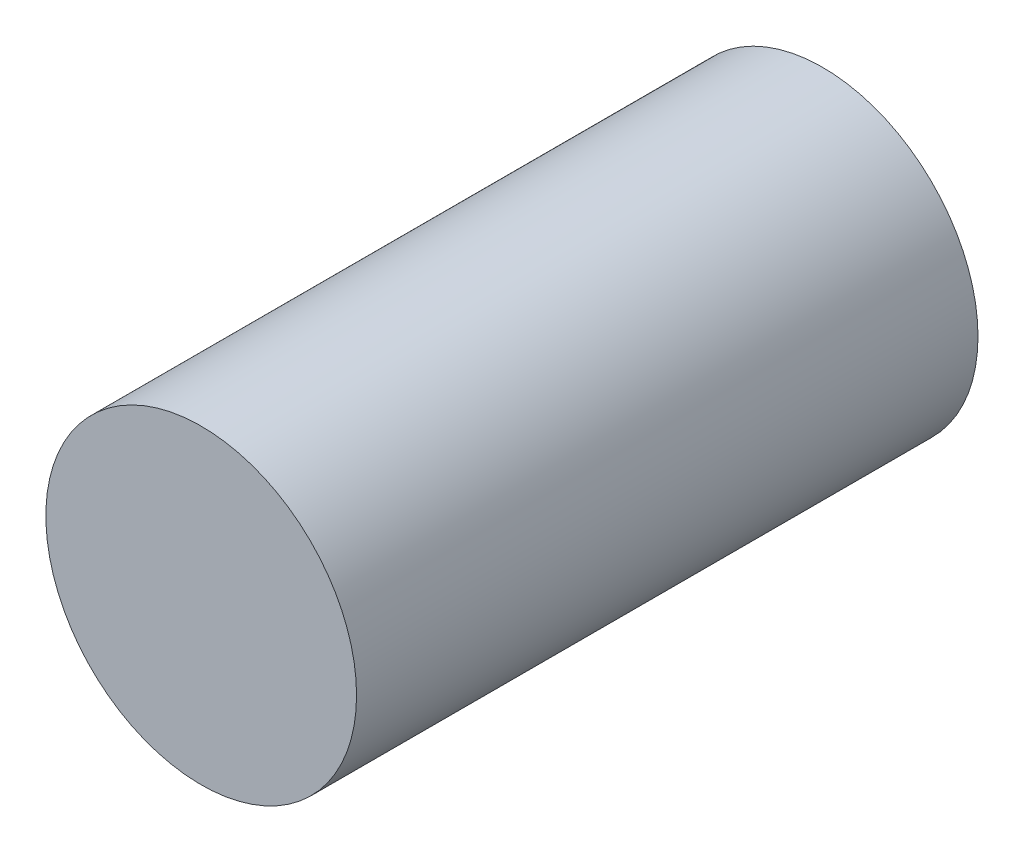
ISO-10303-21;
HEADER;
FILE_DESCRIPTION(('STEP AP214'),'2;1');
FILE_NAME('part.step','',(''),(''),'','','');
FILE_SCHEMA(('AUTOMOTIVE_DESIGN { 1 0 10303 214 1 1 1 1 }'));
ENDSEC;
DATA;
#1=APPLICATION_CONTEXT('core data for automotive mechanical design processes');
#2=APPLICATION_PROTOCOL_DEFINITION('international standard','automotive_design',2000,#1);
#3=PRODUCT_CONTEXT('',#1,'mechanical');
#4=PRODUCT('Part','Part','',(#3));
#5=PRODUCT_RELATED_PRODUCT_CATEGORY('part','',(#4));
#6=PRODUCT_DEFINITION_FORMATION('','',#4);
#7=PRODUCT_DEFINITION_CONTEXT('part definition',#1,'design');
#8=PRODUCT_DEFINITION('design','',#6,#7);
#9=PRODUCT_DEFINITION_SHAPE('','',#8);
#10=(LENGTH_UNIT() NAMED_UNIT(*) SI_UNIT(.MILLI.,.METRE.));
#11=(NAMED_UNIT(*) PLANE_ANGLE_UNIT() SI_UNIT($,.RADIAN.));
#12=(NAMED_UNIT(*) SI_UNIT($,.STERADIAN.) SOLID_ANGLE_UNIT());
#13=UNCERTAINTY_MEASURE_WITH_UNIT(LENGTH_MEASURE(1.E-05),#10,'distance_accuracy_value','');
#14=(GEOMETRIC_REPRESENTATION_CONTEXT(3) GLOBAL_UNCERTAINTY_ASSIGNED_CONTEXT((#13)) GLOBAL_UNIT_ASSIGNED_CONTEXT((#10,
#11,#12)) REPRESENTATION_CONTEXT('',''));
#15=CARTESIAN_POINT('',(0.,0.,0.));
#16=DIRECTION('',(0.,0.,1.));
#17=DIRECTION('',(1.,0.,0.));
#18=AXIS2_PLACEMENT_3D('',#15,#16,#17);
#19=CARTESIAN_POINT('',(0.,0.,200.));
#20=DIRECTION('',(0.,0.,-1.));
#21=DIRECTION('',(-1.,0.,0.));
#22=AXIS2_PLACEMENT_3D('',#19,#20,#21);
#23=CYLINDRICAL_SURFACE('',#22,50.);
#24=CARTESIAN_POINT('',(0.,0.,200.));
#25=DIRECTION('',(0.,0.,1.));
#26=DIRECTION('',(1.,0.,0.));
#27=AXIS2_PLACEMENT_3D('',#24,#25,#26);
#28=CIRCLE('',#27,50.);
#29=CARTESIAN_POINT('',(50.,0.,200.));
#30=VERTEX_POINT('',#29);
#31=EDGE_CURVE('E10',#30,#30,#28,.T.);
#32=ORIENTED_EDGE('',*,*,#31,.F.);
#33=EDGE_LOOP('',(#32));
#34=FACE_BOUND('',#33,.T.);
#35=CARTESIAN_POINT('',(0.,0.,0.));
#36=DIRECTION('',(0.,0.,1.));
#37=DIRECTION('',(1.,0.,0.));
#38=AXIS2_PLACEMENT_3D('',#35,#36,#37);
#39=CIRCLE('',#38,50.);
#40=CARTESIAN_POINT('',(50.,0.,0.));
#41=VERTEX_POINT('',#40);
#42=EDGE_CURVE('E46',#41,#41,#39,.T.);
#43=ORIENTED_EDGE('',*,*,#42,.T.);
#44=EDGE_LOOP('',(#43));
#45=FACE_BOUND('',#44,.T.);
#46=ADVANCED_FACE('F43',(#34,#45),#23,.T.);
#47=CARTESIAN_POINT('',(0.,0.,200.));
#48=DIRECTION('',(0.,0.,1.));
#49=DIRECTION('',(1.,0.,0.));
#50=AXIS2_PLACEMENT_3D('',#47,#48,#49);
#51=PLANE('',#50);
#52=ORIENTED_EDGE('',*,*,#31,.T.);
#53=EDGE_LOOP('',(#52));
#54=FACE_BOUND('',#53,.T.);
#55=ADVANCED_FACE('F60',(#54),#51,.T.);
#56=CARTESIAN_POINT('',(0.,0.,0.));
#57=DIRECTION('',(0.,0.,1.));
#58=DIRECTION('',(1.,0.,0.));
#59=AXIS2_PLACEMENT_3D('',#56,#57,#58);
#60=PLANE('',#59);
#61=ORIENTED_EDGE('',*,*,#42,.F.);
#62=EDGE_LOOP('',(#61));
#63=FACE_BOUND('',#62,.T.);
#64=ADVANCED_FACE('F58',(#63),#60,.F.);
#65=CLOSED_SHELL('',(#46,#55,#64));
#66=MANIFOLD_SOLID_BREP('B2',#65);
#67=ADVANCED_BREP_SHAPE_REPRESENTATION('',(#18,#66),#14);
#68=SHAPE_DEFINITION_REPRESENTATION(#9,#67);
ENDSEC;
END-ISO-10303-21;
